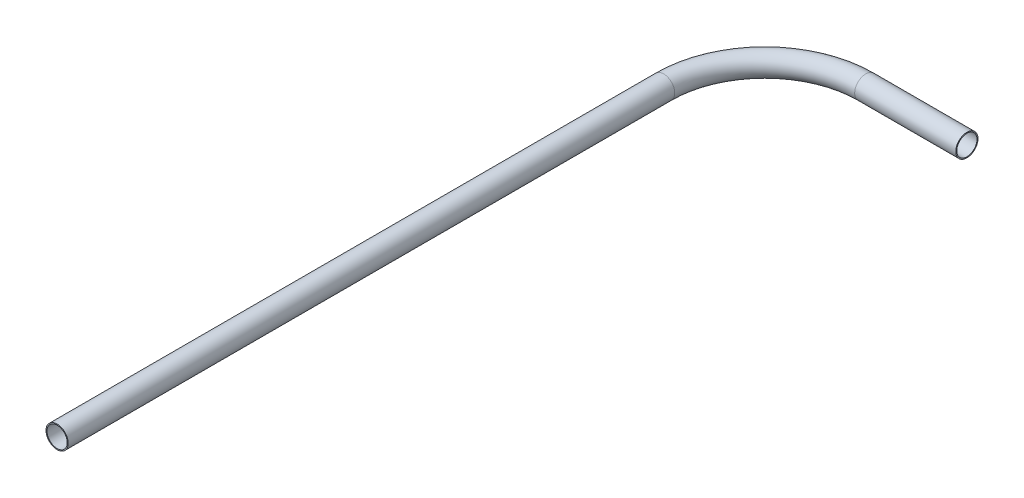
ISO-10303-21;
HEADER;
FILE_DESCRIPTION(('STEP AP214'),'2;1');
FILE_NAME('part.step','',(''),(''),'','','');
FILE_SCHEMA(('AUTOMOTIVE_DESIGN { 1 0 10303 214 1 1 1 1 }'));
ENDSEC;
DATA;
#1=APPLICATION_CONTEXT('core data for automotive mechanical design processes');
#2=APPLICATION_PROTOCOL_DEFINITION('international standard','automotive_design',2000,#1);
#3=PRODUCT_CONTEXT('',#1,'mechanical');
#4=PRODUCT('Part','Part','',(#3));
#5=PRODUCT_RELATED_PRODUCT_CATEGORY('part','',(#4));
#6=PRODUCT_DEFINITION_FORMATION('','',#4);
#7=PRODUCT_DEFINITION_CONTEXT('part definition',#1,'design');
#8=PRODUCT_DEFINITION('design','',#6,#7);
#9=PRODUCT_DEFINITION_SHAPE('','',#8);
#10=(LENGTH_UNIT() NAMED_UNIT(*) SI_UNIT(.MILLI.,.METRE.));
#11=(NAMED_UNIT(*) PLANE_ANGLE_UNIT() SI_UNIT($,.RADIAN.));
#12=(NAMED_UNIT(*) SI_UNIT($,.STERADIAN.) SOLID_ANGLE_UNIT());
#13=UNCERTAINTY_MEASURE_WITH_UNIT(LENGTH_MEASURE(1.E-05),#10,'distance_accuracy_value','');
#14=(GEOMETRIC_REPRESENTATION_CONTEXT(3) GLOBAL_UNCERTAINTY_ASSIGNED_CONTEXT((#13)) GLOBAL_UNIT_ASSIGNED_CONTEXT((#10,
#11,#12)) REPRESENTATION_CONTEXT('',''));
#15=CARTESIAN_POINT('',(0.,0.,0.));
#16=DIRECTION('',(0.,0.,1.));
#17=DIRECTION('',(1.,0.,0.));
#18=AXIS2_PLACEMENT_3D('',#15,#16,#17);
#19=CARTESIAN_POINT('',(0.,0.,0.));
#20=DIRECTION('',(0.,0.,1.));
#21=DIRECTION('',(1.,0.,0.));
#22=AXIS2_PLACEMENT_3D('',#19,#20,#21);
#23=PLANE('',#22);
#24=CARTESIAN_POINT('',(0.,0.,0.));
#25=DIRECTION('',(0.,0.,1.));
#26=DIRECTION('',(1.,0.,0.));
#27=AXIS2_PLACEMENT_3D('',#24,#25,#26);
#28=CIRCLE('',#27,2.54);
#29=CARTESIAN_POINT('',(2.54,0.,0.));
#30=VERTEX_POINT('',#29);
#31=EDGE_CURVE('E68',#30,#30,#28,.T.);
#32=ORIENTED_EDGE('',*,*,#31,.F.);
#33=EDGE_LOOP('',(#32));
#34=FACE_BOUND('',#33,.T.);
#35=CARTESIAN_POINT('',(0.,0.,0.));
#36=DIRECTION('',(0.,0.,1.));
#37=DIRECTION('',(1.,0.,0.));
#38=AXIS2_PLACEMENT_3D('',#35,#36,#37);
#39=CIRCLE('',#38,2.794);
#40=CARTESIAN_POINT('',(2.794,0.,0.));
#41=VERTEX_POINT('',#40);
#42=EDGE_CURVE('E51',#41,#41,#39,.T.);
#43=ORIENTED_EDGE('',*,*,#42,.T.);
#44=EDGE_LOOP('',(#43));
#45=FACE_BOUND('',#44,.T.);
#46=ADVANCED_FACE('F35',(#34,#45),#23,.T.);
#47=CARTESIAN_POINT('',(50.8,0.,-177.8));
#48=DIRECTION('',(-1.,0.,0.));
#49=DIRECTION('',(0.,0.,1.));
#50=AXIS2_PLACEMENT_3D('',#47,#48,#49);
#51=PLANE('',#50);
#52=CARTESIAN_POINT('',(50.8,0.,-177.8));
#53=DIRECTION('',(-1.,0.,0.));
#54=DIRECTION('',(0.,0.,1.));
#55=AXIS2_PLACEMENT_3D('',#52,#53,#54);
#56=CIRCLE('',#55,2.54);
#57=CARTESIAN_POINT('',(50.8,0.,-175.26));
#58=VERTEX_POINT('',#57);
#59=EDGE_CURVE('E55',#58,#58,#56,.T.);
#60=ORIENTED_EDGE('',*,*,#59,.T.);
#61=EDGE_LOOP('',(#60));
#62=FACE_BOUND('',#61,.T.);
#63=CARTESIAN_POINT('',(50.8,0.,-177.8));
#64=DIRECTION('',(-1.,0.,0.));
#65=DIRECTION('',(0.,0.,1.));
#66=AXIS2_PLACEMENT_3D('',#63,#64,#65);
#67=CIRCLE('',#66,2.794);
#68=CARTESIAN_POINT('',(50.8,0.,-175.006));
#69=VERTEX_POINT('',#68);
#70=EDGE_CURVE('E10',#69,#69,#67,.T.);
#71=ORIENTED_EDGE('',*,*,#70,.F.);
#72=EDGE_LOOP('',(#71));
#73=FACE_BOUND('',#72,.T.);
#74=ADVANCED_FACE('F75',(#62,#73),#51,.F.);
#75=CARTESIAN_POINT('',(0.,0.,0.));
#76=DIRECTION('',(0.,0.,-1.));
#77=DIRECTION('',(-1.,0.,0.));
#78=AXIS2_PLACEMENT_3D('',#75,#76,#77);
#79=CYLINDRICAL_SURFACE('',#78,2.794);
#80=CARTESIAN_POINT('',(0.,0.,-152.4));
#81=DIRECTION('',(0.,0.,-1.));
#82=DIRECTION('',(-1.,0.,0.));
#83=AXIS2_PLACEMENT_3D('',#80,#81,#82);
#84=CIRCLE('',#83,2.794);
#85=CARTESIAN_POINT('',(-2.794,0.,-152.4));
#86=VERTEX_POINT('',#85);
#87=EDGE_CURVE('E46',#86,#86,#84,.F.);
#88=ORIENTED_EDGE('',*,*,#87,.T.);
#89=EDGE_LOOP('',(#88));
#90=FACE_BOUND('',#89,.T.);
#91=ORIENTED_EDGE('',*,*,#42,.F.);
#92=EDGE_LOOP('',(#91));
#93=FACE_BOUND('',#92,.T.);
#94=ADVANCED_FACE('F81',(#90,#93),#79,.T.);
#95=CARTESIAN_POINT('',(25.4,0.,-152.4));
#96=DIRECTION('',(0.,-1.,0.));
#97=DIRECTION('',(0.,0.,-1.));
#98=AXIS2_PLACEMENT_3D('',#95,#96,#97);
#99=TOROIDAL_SURFACE('',#98,25.4,2.794);
#100=CARTESIAN_POINT('',(25.4,0.,-177.8));
#101=DIRECTION('',(-1.,0.,0.));
#102=DIRECTION('',(0.,0.,1.));
#103=AXIS2_PLACEMENT_3D('',#100,#101,#102);
#104=CIRCLE('',#103,2.794);
#105=CARTESIAN_POINT('',(25.4,0.,-180.594));
#106=VERTEX_POINT('',#105);
#107=EDGE_CURVE('E42',#106,#106,#104,.T.);
#108=CARTESIAN_POINT('',(25.4,0.,-152.4));
#109=DIRECTION('',(0.,-1.,0.));
#110=DIRECTION('',(0.,0.,-1.));
#111=AXIS2_PLACEMENT_3D('',#108,#109,#110);
#112=CIRCLE('',#111,28.194);
#113=EDGE_CURVE('',#86,#106,#112,.T.);
#114=ORIENTED_EDGE('',*,*,#87,.F.);
#115=ORIENTED_EDGE('',*,*,#107,.T.);
#116=ORIENTED_EDGE('',*,*,#113,.T.);
#117=ORIENTED_EDGE('',*,*,#113,.F.);
#118=EDGE_LOOP('',(#114,#116,#115,#117));
#119=FACE_BOUND('',#118,.T.);
#120=ADVANCED_FACE('F89',(#119),#99,.T.);
#121=CARTESIAN_POINT('',(25.4,0.,-177.8));
#122=DIRECTION('',(1.,0.,0.));
#123=DIRECTION('',(0.,0.,-1.));
#124=AXIS2_PLACEMENT_3D('',#121,#122,#123);
#125=CYLINDRICAL_SURFACE('',#124,2.794);
#126=ORIENTED_EDGE('',*,*,#70,.T.);
#127=EDGE_LOOP('',(#126));
#128=FACE_BOUND('',#127,.T.);
#129=ORIENTED_EDGE('',*,*,#107,.F.);
#130=EDGE_LOOP('',(#129));
#131=FACE_BOUND('',#130,.T.);
#132=ADVANCED_FACE('F37',(#128,#131),#125,.T.);
#133=CARTESIAN_POINT('',(0.,0.,0.));
#134=DIRECTION('',(0.,0.,-1.));
#135=DIRECTION('',(-1.,0.,0.));
#136=AXIS2_PLACEMENT_3D('',#133,#134,#135);
#137=CYLINDRICAL_SURFACE('',#136,2.54);
#138=CARTESIAN_POINT('',(0.,0.,-152.4));
#139=DIRECTION('',(0.,0.,1.));
#140=DIRECTION('',(1.,0.,0.));
#141=AXIS2_PLACEMENT_3D('',#138,#139,#140);
#142=CIRCLE('',#141,2.54);
#143=CARTESIAN_POINT('',(-2.54,0.,-152.4));
#144=VERTEX_POINT('',#143);
#145=EDGE_CURVE('E63',#144,#144,#142,.T.);
#146=ORIENTED_EDGE('',*,*,#145,.F.);
#147=EDGE_LOOP('',(#146));
#148=FACE_BOUND('',#147,.T.);
#149=ORIENTED_EDGE('',*,*,#31,.T.);
#150=EDGE_LOOP('',(#149));
#151=FACE_BOUND('',#150,.T.);
#152=ADVANCED_FACE('F72',(#148,#151),#137,.F.);
#153=CARTESIAN_POINT('',(25.4,0.,-152.4));
#154=DIRECTION('',(0.,-1.,0.));
#155=DIRECTION('',(0.,0.,-1.));
#156=AXIS2_PLACEMENT_3D('',#153,#154,#155);
#157=TOROIDAL_SURFACE('',#156,25.4,2.54);
#158=CARTESIAN_POINT('',(25.4,0.,-177.8));
#159=DIRECTION('',(-1.,0.,0.));
#160=DIRECTION('',(0.,0.,1.));
#161=AXIS2_PLACEMENT_3D('',#158,#159,#160);
#162=CIRCLE('',#161,2.54);
#163=CARTESIAN_POINT('',(25.4,0.,-180.34));
#164=VERTEX_POINT('',#163);
#165=EDGE_CURVE('E59',#164,#164,#162,.T.);
#166=CARTESIAN_POINT('',(25.4,0.,-152.4));
#167=DIRECTION('',(0.,-1.,0.));
#168=DIRECTION('',(0.,0.,-1.));
#169=AXIS2_PLACEMENT_3D('',#166,#167,#168);
#170=CIRCLE('',#169,27.94);
#171=EDGE_CURVE('',#144,#164,#170,.T.);
#172=ORIENTED_EDGE('',*,*,#145,.T.);
#173=ORIENTED_EDGE('',*,*,#165,.F.);
#174=ORIENTED_EDGE('',*,*,#171,.T.);
#175=ORIENTED_EDGE('',*,*,#171,.F.);
#176=EDGE_LOOP('',(#172,#174,#173,#175));
#177=FACE_BOUND('',#176,.T.);
#178=ADVANCED_FACE('F85',(#177),#157,.F.);
#179=CARTESIAN_POINT('',(25.4,0.,-177.8));
#180=DIRECTION('',(1.,0.,0.));
#181=DIRECTION('',(0.,0.,-1.));
#182=AXIS2_PLACEMENT_3D('',#179,#180,#181);
#183=CYLINDRICAL_SURFACE('',#182,2.54);
#184=ORIENTED_EDGE('',*,*,#59,.F.);
#185=EDGE_LOOP('',(#184));
#186=FACE_BOUND('',#185,.T.);
#187=ORIENTED_EDGE('',*,*,#165,.T.);
#188=EDGE_LOOP('',(#187));
#189=FACE_BOUND('',#188,.T.);
#190=ADVANCED_FACE('F77',(#186,#189),#183,.F.);
#191=CLOSED_SHELL('',(#46,#74,#94,#120,#132,#152,#178,#190));
#192=MANIFOLD_SOLID_BREP('B2',#191);
#193=ADVANCED_BREP_SHAPE_REPRESENTATION('',(#18,#192),#14);
#194=SHAPE_DEFINITION_REPRESENTATION(#9,#193);
ENDSEC;
END-ISO-10303-21;
